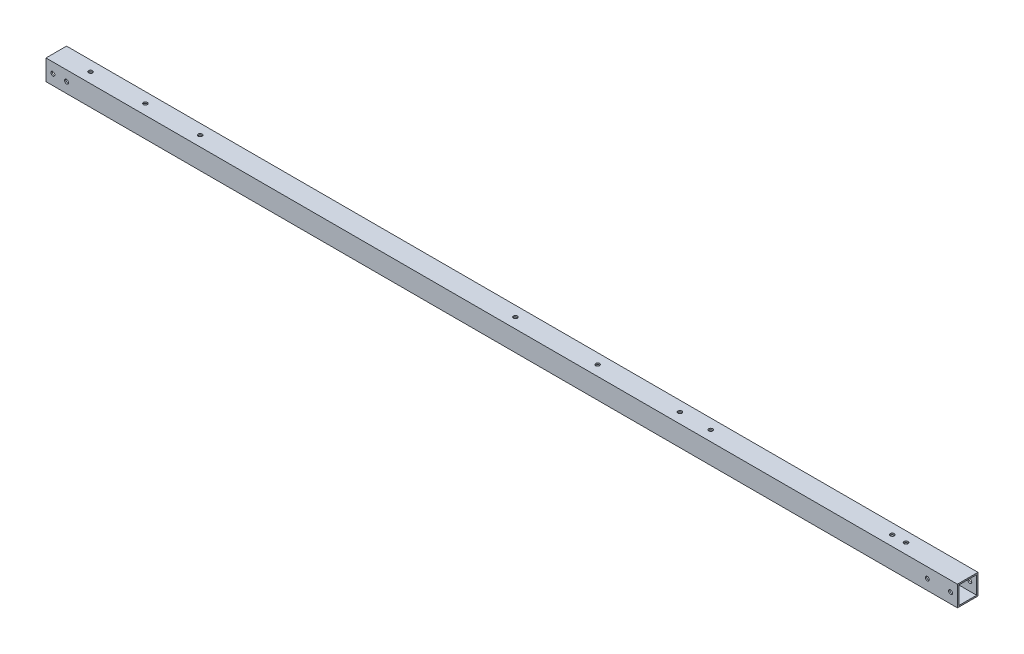
ISO-10303-21;
HEADER;
FILE_DESCRIPTION(('STEP AP214'),'2;1');
FILE_NAME('part.step','',(''),(''),'','','');
FILE_SCHEMA(('AUTOMOTIVE_DESIGN { 1 0 10303 214 1 1 1 1 }'));
ENDSEC;
DATA;
#1=APPLICATION_CONTEXT('core data for automotive mechanical design processes');
#2=APPLICATION_PROTOCOL_DEFINITION('international standard','automotive_design',2000,#1);
#3=PRODUCT_CONTEXT('',#1,'mechanical');
#4=PRODUCT('Part','Part','',(#3));
#5=PRODUCT_RELATED_PRODUCT_CATEGORY('part','',(#4));
#6=PRODUCT_DEFINITION_FORMATION('','',#4);
#7=PRODUCT_DEFINITION_CONTEXT('part definition',#1,'design');
#8=PRODUCT_DEFINITION('design','',#6,#7);
#9=PRODUCT_DEFINITION_SHAPE('','',#8);
#10=(LENGTH_UNIT() NAMED_UNIT(*) SI_UNIT(.MILLI.,.METRE.));
#11=(NAMED_UNIT(*) PLANE_ANGLE_UNIT() SI_UNIT($,.RADIAN.));
#12=(NAMED_UNIT(*) SI_UNIT($,.STERADIAN.) SOLID_ANGLE_UNIT());
#13=UNCERTAINTY_MEASURE_WITH_UNIT(LENGTH_MEASURE(1.E-05),#10,'distance_accuracy_value','');
#14=(GEOMETRIC_REPRESENTATION_CONTEXT(3) GLOBAL_UNCERTAINTY_ASSIGNED_CONTEXT((#13)) GLOBAL_UNIT_ASSIGNED_CONTEXT((#10,
#11,#12)) REPRESENTATION_CONTEXT('',''));
#15=CARTESIAN_POINT('',(0.,0.,0.));
#16=DIRECTION('',(0.,0.,1.));
#17=DIRECTION('',(1.,0.,0.));
#18=AXIS2_PLACEMENT_3D('',#15,#16,#17);
#19=CARTESIAN_POINT('',(665.,0.,0.));
#20=DIRECTION('',(-1.,0.,0.));
#21=DIRECTION('',(0.,0.,1.));
#22=AXIS2_PLACEMENT_3D('',#19,#20,#21);
#23=PLANE('',#22);
#24=DIRECTION('',(0.,1.,0.));
#25=VECTOR('',#24,1.);
#26=CARTESIAN_POINT('',(665.,-7.5,-7.5));
#27=LINE('',#26,#25);
#28=CARTESIAN_POINT('',(665.,-7.5,-7.5));
#29=VERTEX_POINT('',#28);
#30=CARTESIAN_POINT('',(665.,7.5,-7.5));
#31=VERTEX_POINT('',#30);
#32=EDGE_CURVE('E146',#29,#31,#27,.T.);
#33=ORIENTED_EDGE('',*,*,#32,.T.);
#34=DIRECTION('',(0.,0.,1.));
#35=VECTOR('',#34,1.);
#36=CARTESIAN_POINT('',(665.,7.5,7.5));
#37=LINE('',#36,#35);
#38=CARTESIAN_POINT('',(665.,7.5,7.5));
#39=VERTEX_POINT('',#38);
#40=EDGE_CURVE('E149',#31,#39,#37,.T.);
#41=ORIENTED_EDGE('',*,*,#40,.T.);
#42=DIRECTION('',(0.,-1.,0.));
#43=VECTOR('',#42,1.);
#44=CARTESIAN_POINT('',(665.,-7.5,7.5));
#45=LINE('',#44,#43);
#46=CARTESIAN_POINT('',(665.,-7.5,7.5));
#47=VERTEX_POINT('',#46);
#48=EDGE_CURVE('E152',#39,#47,#45,.T.);
#49=ORIENTED_EDGE('',*,*,#48,.T.);
#50=DIRECTION('',(0.,0.,-1.));
#51=VECTOR('',#50,1.);
#52=CARTESIAN_POINT('',(665.,-7.5,7.5));
#53=LINE('',#52,#51);
#54=EDGE_CURVE('E154',#47,#29,#53,.T.);
#55=ORIENTED_EDGE('',*,*,#54,.T.);
#56=EDGE_LOOP('',(#33,#41,#49,#55));
#57=FACE_BOUND('',#56,.T.);
#58=DIRECTION('',(0.,0.,-1.));
#59=VECTOR('',#58,1.);
#60=CARTESIAN_POINT('',(665.,-6.5,6.5));
#61=LINE('',#60,#59);
#62=CARTESIAN_POINT('',(665.,-6.5,6.5));
#63=VERTEX_POINT('',#62);
#64=CARTESIAN_POINT('',(665.,-6.5,-6.5));
#65=VERTEX_POINT('',#64);
#66=EDGE_CURVE('E108',#63,#65,#61,.T.);
#67=ORIENTED_EDGE('',*,*,#66,.F.);
#68=DIRECTION('',(0.,-1.,0.));
#69=VECTOR('',#68,1.);
#70=CARTESIAN_POINT('',(665.,-6.5,6.5));
#71=LINE('',#70,#69);
#72=CARTESIAN_POINT('',(665.,6.5,6.5));
#73=VERTEX_POINT('',#72);
#74=EDGE_CURVE('E130',#73,#63,#71,.T.);
#75=ORIENTED_EDGE('',*,*,#74,.F.);
#76=DIRECTION('',(0.,0.,1.));
#77=VECTOR('',#76,1.);
#78=CARTESIAN_POINT('',(665.,6.5,6.5));
#79=LINE('',#78,#77);
#80=CARTESIAN_POINT('',(665.,6.5,-6.5));
#81=VERTEX_POINT('',#80);
#82=EDGE_CURVE('E128',#81,#73,#79,.T.);
#83=ORIENTED_EDGE('',*,*,#82,.F.);
#84=DIRECTION('',(0.,1.,0.));
#85=VECTOR('',#84,1.);
#86=CARTESIAN_POINT('',(665.,-6.5,-6.5));
#87=LINE('',#86,#85);
#88=EDGE_CURVE('E116',#65,#81,#87,.T.);
#89=ORIENTED_EDGE('',*,*,#88,.F.);
#90=EDGE_LOOP('',(#67,#75,#83,#89));
#91=FACE_BOUND('',#90,.T.);
#92=ADVANCED_FACE('F41',(#57,#91),#23,.F.);
#93=CARTESIAN_POINT('',(0.,0.,0.));
#94=DIRECTION('',(-1.,0.,0.));
#95=DIRECTION('',(0.,0.,1.));
#96=AXIS2_PLACEMENT_3D('',#93,#94,#95);
#97=PLANE('',#96);
#98=DIRECTION('',(0.,1.,0.));
#99=VECTOR('',#98,1.);
#100=CARTESIAN_POINT('',(0.,-7.5,-7.5));
#101=LINE('',#100,#99);
#102=CARTESIAN_POINT('',(0.,-7.5,-7.5));
#103=VERTEX_POINT('',#102);
#104=CARTESIAN_POINT('',(0.,7.5,-7.5));
#105=VERTEX_POINT('',#104);
#106=EDGE_CURVE('E124',#103,#105,#101,.T.);
#107=ORIENTED_EDGE('',*,*,#106,.F.);
#108=DIRECTION('',(0.,0.,-1.));
#109=VECTOR('',#108,1.);
#110=CARTESIAN_POINT('',(0.,-7.5,7.5));
#111=LINE('',#110,#109);
#112=CARTESIAN_POINT('',(0.,-7.5,7.5));
#113=VERTEX_POINT('',#112);
#114=EDGE_CURVE('E150',#113,#103,#111,.T.);
#115=ORIENTED_EDGE('',*,*,#114,.F.);
#116=DIRECTION('',(0.,-1.,0.));
#117=VECTOR('',#116,1.);
#118=CARTESIAN_POINT('',(0.,-7.5,7.5));
#119=LINE('',#118,#117);
#120=CARTESIAN_POINT('',(0.,7.5,7.5));
#121=VERTEX_POINT('',#120);
#122=EDGE_CURVE('E161',#121,#113,#119,.T.);
#123=ORIENTED_EDGE('',*,*,#122,.F.);
#124=DIRECTION('',(0.,0.,1.));
#125=VECTOR('',#124,1.);
#126=CARTESIAN_POINT('',(0.,7.5,7.5));
#127=LINE('',#126,#125);
#128=EDGE_CURVE('E159',#105,#121,#127,.T.);
#129=ORIENTED_EDGE('',*,*,#128,.F.);
#130=EDGE_LOOP('',(#107,#115,#123,#129));
#131=FACE_BOUND('',#130,.T.);
#132=DIRECTION('',(0.,-1.,0.));
#133=VECTOR('',#132,1.);
#134=CARTESIAN_POINT('',(0.,-6.5,6.5));
#135=LINE('',#134,#133);
#136=CARTESIAN_POINT('',(0.,6.5,6.5));
#137=VERTEX_POINT('',#136);
#138=CARTESIAN_POINT('',(0.,-6.5,6.5));
#139=VERTEX_POINT('',#138);
#140=EDGE_CURVE('E117',#137,#139,#135,.T.);
#141=ORIENTED_EDGE('',*,*,#140,.T.);
#142=DIRECTION('',(0.,0.,-1.));
#143=VECTOR('',#142,1.);
#144=CARTESIAN_POINT('',(0.,-6.5,6.5));
#145=LINE('',#144,#143);
#146=CARTESIAN_POINT('',(0.,-6.5,-6.5));
#147=VERTEX_POINT('',#146);
#148=EDGE_CURVE('E66',#139,#147,#145,.T.);
#149=ORIENTED_EDGE('',*,*,#148,.T.);
#150=DIRECTION('',(0.,1.,0.));
#151=VECTOR('',#150,1.);
#152=CARTESIAN_POINT('',(0.,-6.5,-6.5));
#153=LINE('',#152,#151);
#154=CARTESIAN_POINT('',(0.,6.5,-6.5));
#155=VERTEX_POINT('',#154);
#156=EDGE_CURVE('E123',#147,#155,#153,.T.);
#157=ORIENTED_EDGE('',*,*,#156,.T.);
#158=DIRECTION('',(0.,0.,1.));
#159=VECTOR('',#158,1.);
#160=CARTESIAN_POINT('',(0.,6.5,6.5));
#161=LINE('',#160,#159);
#162=EDGE_CURVE('E138',#155,#137,#161,.T.);
#163=ORIENTED_EDGE('',*,*,#162,.T.);
#164=EDGE_LOOP('',(#141,#149,#157,#163));
#165=FACE_BOUND('',#164,.T.);
#166=ADVANCED_FACE('F350',(#131,#165),#97,.T.);
#167=CARTESIAN_POINT('',(665.,-7.5,-7.5));
#168=DIRECTION('',(0.,0.,1.));
#169=DIRECTION('',(1.,0.,0.));
#170=AXIS2_PLACEMENT_3D('',#167,#168,#169);
#171=PLANE('',#170);
#172=CARTESIAN_POINT('',(4.99999999825829,-1.26358125351889E-10,-7.5));
#173=DIRECTION('',(0.,0.,1.));
#174=DIRECTION('',(1.,0.,0.));
#175=AXIS2_PLACEMENT_3D('',#172,#173,#174);
#176=CIRCLE('',#175,1.44999999999994);
#177=CARTESIAN_POINT('',(6.44999999825823,-1.26358125351889E-10,-7.5));
#178=VERTEX_POINT('',#177);
#179=EDGE_CURVE('E468',#178,#178,#176,.T.);
#180=ORIENTED_EDGE('',*,*,#179,.T.);
#181=EDGE_LOOP('',(#180));
#182=FACE_BOUND('',#181,.T.);
#183=CARTESIAN_POINT('',(660.000000000002,-1.49877506239182E-10,-7.5));
#184=DIRECTION('',(0.,0.,1.));
#185=DIRECTION('',(1.,0.,0.));
#186=AXIS2_PLACEMENT_3D('',#183,#184,#185);
#187=CIRCLE('',#186,1.45000000000005);
#188=CARTESIAN_POINT('',(661.450000000002,-1.49877506239182E-10,-7.5));
#189=VERTEX_POINT('',#188);
#190=EDGE_CURVE('E461',#189,#189,#187,.T.);
#191=ORIENTED_EDGE('',*,*,#190,.T.);
#192=EDGE_LOOP('',(#191));
#193=FACE_BOUND('',#192,.T.);
#194=CARTESIAN_POINT('',(643.000000000002,-1.46057645145081E-10,-7.5));
#195=DIRECTION('',(0.,0.,1.));
#196=DIRECTION('',(1.,0.,0.));
#197=AXIS2_PLACEMENT_3D('',#194,#195,#196);
#198=CIRCLE('',#197,1.44999999999995);
#199=CARTESIAN_POINT('',(644.450000000002,-1.46057645145081E-10,-7.5));
#200=VERTEX_POINT('',#199);
#201=EDGE_CURVE('E456',#200,#200,#198,.T.);
#202=ORIENTED_EDGE('',*,*,#201,.T.);
#203=EDGE_LOOP('',(#202));
#204=FACE_BOUND('',#203,.T.);
#205=CARTESIAN_POINT('',(14.9999999982583,-1.26345982287557E-10,-7.5));
#206=DIRECTION('',(0.,0.,1.));
#207=DIRECTION('',(1.,0.,0.));
#208=AXIS2_PLACEMENT_3D('',#205,#206,#207);
#209=CIRCLE('',#208,1.44999999999994);
#210=CARTESIAN_POINT('',(16.4499999982582,-1.26345982287557E-10,-7.5));
#211=VERTEX_POINT('',#210);
#212=EDGE_CURVE('E211',#211,#211,#209,.T.);
#213=ORIENTED_EDGE('',*,*,#212,.T.);
#214=EDGE_LOOP('',(#213));
#215=FACE_BOUND('',#214,.T.);
#216=ORIENTED_EDGE('',*,*,#106,.T.);
#217=DIRECTION('',(-1.,0.,0.));
#218=VECTOR('',#217,1.);
#219=CARTESIAN_POINT('',(665.,7.5,-7.5));
#220=LINE('',#219,#218);
#221=EDGE_CURVE('E11',#31,#105,#220,.T.);
#222=ORIENTED_EDGE('',*,*,#221,.F.);
#223=ORIENTED_EDGE('',*,*,#32,.F.);
#224=DIRECTION('',(-1.,0.,0.));
#225=VECTOR('',#224,1.);
#226=CARTESIAN_POINT('',(665.,-7.5,-7.5));
#227=LINE('',#226,#225);
#228=EDGE_CURVE('E156',#29,#103,#227,.T.);
#229=ORIENTED_EDGE('',*,*,#228,.T.);
#230=EDGE_LOOP('',(#216,#222,#223,#229));
#231=FACE_BOUND('',#230,.T.);
#232=ADVANCED_FACE('F43',(#182,#193,#204,#215,#231),#171,.F.);
#233=CARTESIAN_POINT('',(665.,7.5,7.5));
#234=DIRECTION('',(0.,-1.,0.));
#235=DIRECTION('',(0.,0.,-1.));
#236=AXIS2_PLACEMENT_3D('',#233,#234,#235);
#237=PLANE('',#236);
#238=CARTESIAN_POINT('',(477.5,7.5,0.));
#239=DIRECTION('',(0.,1.,0.));
#240=DIRECTION('',(0.,0.,1.));
#241=AXIS2_PLACEMENT_3D('',#238,#239,#240);
#242=CIRCLE('',#241,1.45);
#243=CARTESIAN_POINT('',(477.5,7.5,1.45000000000006));
#244=VERTEX_POINT('',#243);
#245=EDGE_CURVE('E257',#244,#244,#242,.T.);
#246=ORIENTED_EDGE('',*,*,#245,.F.);
#247=EDGE_LOOP('',(#246));
#248=FACE_BOUND('',#247,.T.);
#249=CARTESIAN_POINT('',(455.,7.5,0.));
#250=DIRECTION('',(0.,1.,0.));
#251=DIRECTION('',(0.,0.,1.));
#252=AXIS2_PLACEMENT_3D('',#249,#250,#251);
#253=CIRCLE('',#252,1.45);
#254=CARTESIAN_POINT('',(455.,7.5,1.45000000000006));
#255=VERTEX_POINT('',#254);
#256=EDGE_CURVE('E264',#255,#255,#253,.T.);
#257=ORIENTED_EDGE('',*,*,#256,.F.);
#258=EDGE_LOOP('',(#257));
#259=FACE_BOUND('',#258,.T.);
#260=CARTESIAN_POINT('',(395.,7.5,0.));
#261=DIRECTION('',(0.,1.,0.));
#262=DIRECTION('',(0.,0.,1.));
#263=AXIS2_PLACEMENT_3D('',#260,#261,#262);
#264=CIRCLE('',#263,1.45);
#265=CARTESIAN_POINT('',(395.,7.5,1.45000000000007));
#266=VERTEX_POINT('',#265);
#267=EDGE_CURVE('E270',#266,#266,#264,.T.);
#268=ORIENTED_EDGE('',*,*,#267,.F.);
#269=EDGE_LOOP('',(#268));
#270=FACE_BOUND('',#269,.T.);
#271=CARTESIAN_POINT('',(335.,7.5,0.));
#272=DIRECTION('',(0.,1.,0.));
#273=DIRECTION('',(0.,0.,1.));
#274=AXIS2_PLACEMENT_3D('',#271,#272,#273);
#275=CIRCLE('',#274,1.45);
#276=CARTESIAN_POINT('',(335.,7.5,1.45000000000008));
#277=VERTEX_POINT('',#276);
#278=EDGE_CURVE('E276',#277,#277,#275,.T.);
#279=ORIENTED_EDGE('',*,*,#278,.F.);
#280=EDGE_LOOP('',(#279));
#281=FACE_BOUND('',#280,.T.);
#282=CARTESIAN_POINT('',(620.,7.5,-8.56953397132543E-13));
#283=DIRECTION('',(0.,1.,0.));
#284=DIRECTION('',(0.,0.,1.));
#285=AXIS2_PLACEMENT_3D('',#282,#283,#284);
#286=CIRCLE('',#285,1.44999999999994);
#287=CARTESIAN_POINT('',(620.,7.5,1.44999999999909));
#288=VERTEX_POINT('',#287);
#289=EDGE_CURVE('E240',#288,#288,#286,.T.);
#290=ORIENTED_EDGE('',*,*,#289,.F.);
#291=EDGE_LOOP('',(#290));
#292=FACE_BOUND('',#291,.T.);
#293=CARTESIAN_POINT('',(25.0000000000008,7.5,-3.46944695195361E-13));
#294=DIRECTION('',(0.,1.,0.));
#295=DIRECTION('',(0.,0.,1.));
#296=AXIS2_PLACEMENT_3D('',#293,#294,#295);
#297=CIRCLE('',#296,1.45);
#298=CARTESIAN_POINT('',(25.0000000000008,7.5,1.44999999999965));
#299=VERTEX_POINT('',#298);
#300=EDGE_CURVE('E233',#299,#299,#297,.T.);
#301=ORIENTED_EDGE('',*,*,#300,.F.);
#302=EDGE_LOOP('',(#301));
#303=FACE_BOUND('',#302,.T.);
#304=CARTESIAN_POINT('',(65.0000000000008,7.5,-3.53883589099269E-13));
#305=DIRECTION('',(0.,1.,0.));
#306=DIRECTION('',(0.,0.,1.));
#307=AXIS2_PLACEMENT_3D('',#304,#305,#306);
#308=CIRCLE('',#307,1.45);
#309=CARTESIAN_POINT('',(65.0000000000008,7.5,1.44999999999965));
#310=VERTEX_POINT('',#309);
#311=EDGE_CURVE('E252',#310,#310,#308,.T.);
#312=ORIENTED_EDGE('',*,*,#311,.F.);
#313=EDGE_LOOP('',(#312));
#314=FACE_BOUND('',#313,.T.);
#315=CARTESIAN_POINT('',(105.000000000001,7.5,-3.60822483003176E-13));
#316=DIRECTION('',(0.,1.,0.));
#317=DIRECTION('',(0.,0.,1.));
#318=AXIS2_PLACEMENT_3D('',#315,#316,#317);
#319=CIRCLE('',#318,1.45);
#320=CARTESIAN_POINT('',(105.000000000001,7.5,1.44999999999964));
#321=VERTEX_POINT('',#320);
#322=EDGE_CURVE('E245',#321,#321,#319,.T.);
#323=ORIENTED_EDGE('',*,*,#322,.F.);
#324=EDGE_LOOP('',(#323));
#325=FACE_BOUND('',#324,.T.);
#326=CARTESIAN_POINT('',(610.,7.5,-8.56953397132543E-13));
#327=DIRECTION('',(0.,1.,0.));
#328=DIRECTION('',(0.,0.,1.));
#329=AXIS2_PLACEMENT_3D('',#326,#327,#328);
#330=CIRCLE('',#329,1.44999999999994);
#331=CARTESIAN_POINT('',(610.,7.5,1.44999999999909));
#332=VERTEX_POINT('',#331);
#333=EDGE_CURVE('E260',#332,#332,#330,.T.);
#334=ORIENTED_EDGE('',*,*,#333,.F.);
#335=EDGE_LOOP('',(#334));
#336=FACE_BOUND('',#335,.T.);
#337=ORIENTED_EDGE('',*,*,#128,.T.);
#338=DIRECTION('',(-1.,0.,0.));
#339=VECTOR('',#338,1.);
#340=CARTESIAN_POINT('',(665.,7.5,7.5));
#341=LINE('',#340,#339);
#342=EDGE_CURVE('E50',#39,#121,#341,.T.);
#343=ORIENTED_EDGE('',*,*,#342,.F.);
#344=ORIENTED_EDGE('',*,*,#40,.F.);
#345=ORIENTED_EDGE('',*,*,#221,.T.);
#346=EDGE_LOOP('',(#337,#343,#344,#345));
#347=FACE_BOUND('',#346,.T.);
#348=ADVANCED_FACE('F354',(#248,#259,#270,#281,#292,#303,#314,#325,#336,#347),#237,.F.);
#349=CARTESIAN_POINT('',(665.,-7.5,7.5));
#350=DIRECTION('',(0.,0.,-1.));
#351=DIRECTION('',(-1.,0.,0.));
#352=AXIS2_PLACEMENT_3D('',#349,#350,#351);
#353=PLANE('',#352);
#354=CARTESIAN_POINT('',(4.99999999825829,-1.26358125351889E-10,7.5));
#355=DIRECTION('',(0.,0.,1.));
#356=DIRECTION('',(1.,0.,0.));
#357=AXIS2_PLACEMENT_3D('',#354,#355,#356);
#358=CIRCLE('',#357,1.44999999999994);
#359=CARTESIAN_POINT('',(6.44999999825823,-1.26358125351889E-10,7.5));
#360=VERTEX_POINT('',#359);
#361=EDGE_CURVE('E464',#360,#360,#358,.T.);
#362=ORIENTED_EDGE('',*,*,#361,.F.);
#363=EDGE_LOOP('',(#362));
#364=FACE_BOUND('',#363,.T.);
#365=CARTESIAN_POINT('',(660.000000000002,-1.49877506239182E-10,7.5));
#366=DIRECTION('',(0.,0.,1.));
#367=DIRECTION('',(1.,0.,0.));
#368=AXIS2_PLACEMENT_3D('',#365,#366,#367);
#369=CIRCLE('',#368,1.45000000000005);
#370=CARTESIAN_POINT('',(661.450000000002,-1.49877506239182E-10,7.5));
#371=VERTEX_POINT('',#370);
#372=EDGE_CURVE('E471',#371,#371,#369,.T.);
#373=ORIENTED_EDGE('',*,*,#372,.F.);
#374=EDGE_LOOP('',(#373));
#375=FACE_BOUND('',#374,.T.);
#376=CARTESIAN_POINT('',(643.000000000002,-1.46057645145081E-10,7.5));
#377=DIRECTION('',(0.,0.,1.));
#378=DIRECTION('',(1.,0.,0.));
#379=AXIS2_PLACEMENT_3D('',#376,#377,#378);
#380=CIRCLE('',#379,1.44999999999995);
#381=CARTESIAN_POINT('',(644.450000000002,-1.46057645145081E-10,7.5));
#382=VERTEX_POINT('',#381);
#383=EDGE_CURVE('E458',#382,#382,#380,.T.);
#384=ORIENTED_EDGE('',*,*,#383,.F.);
#385=EDGE_LOOP('',(#384));
#386=FACE_BOUND('',#385,.T.);
#387=CARTESIAN_POINT('',(14.9999999982583,-1.26345982287557E-10,7.5));
#388=DIRECTION('',(0.,0.,1.));
#389=DIRECTION('',(1.,0.,0.));
#390=AXIS2_PLACEMENT_3D('',#387,#388,#389);
#391=CIRCLE('',#390,1.44999999999994);
#392=CARTESIAN_POINT('',(16.4499999982582,-1.26345982287557E-10,7.5));
#393=VERTEX_POINT('',#392);
#394=EDGE_CURVE('E467',#393,#393,#391,.T.);
#395=ORIENTED_EDGE('',*,*,#394,.F.);
#396=EDGE_LOOP('',(#395));
#397=FACE_BOUND('',#396,.T.);
#398=ORIENTED_EDGE('',*,*,#122,.T.);
#399=DIRECTION('',(-1.,0.,0.));
#400=VECTOR('',#399,1.);
#401=CARTESIAN_POINT('',(665.,-7.5,7.5));
#402=LINE('',#401,#400);
#403=EDGE_CURVE('E166',#47,#113,#402,.T.);
#404=ORIENTED_EDGE('',*,*,#403,.F.);
#405=ORIENTED_EDGE('',*,*,#48,.F.);
#406=ORIENTED_EDGE('',*,*,#342,.T.);
#407=EDGE_LOOP('',(#398,#404,#405,#406));
#408=FACE_BOUND('',#407,.T.);
#409=ADVANCED_FACE('F337',(#364,#375,#386,#397,#408),#353,.F.);
#410=CARTESIAN_POINT('',(665.,-7.5,7.5));
#411=DIRECTION('',(0.,1.,0.));
#412=DIRECTION('',(0.,0.,1.));
#413=AXIS2_PLACEMENT_3D('',#410,#411,#412);
#414=PLANE('',#413);
#415=CARTESIAN_POINT('',(477.5,-7.5,0.));
#416=DIRECTION('',(0.,1.,0.));
#417=DIRECTION('',(0.,0.,1.));
#418=AXIS2_PLACEMENT_3D('',#415,#416,#417);
#419=CIRCLE('',#418,1.45);
#420=CARTESIAN_POINT('',(477.5,-7.5,1.45000000000006));
#421=VERTEX_POINT('',#420);
#422=EDGE_CURVE('E261',#421,#421,#419,.T.);
#423=ORIENTED_EDGE('',*,*,#422,.T.);
#424=EDGE_LOOP('',(#423));
#425=FACE_BOUND('',#424,.T.);
#426=CARTESIAN_POINT('',(455.,-7.5,0.));
#427=DIRECTION('',(0.,1.,0.));
#428=DIRECTION('',(0.,0.,1.));
#429=AXIS2_PLACEMENT_3D('',#426,#427,#428);
#430=CIRCLE('',#429,1.45);
#431=CARTESIAN_POINT('',(455.,-7.5,1.45000000000006));
#432=VERTEX_POINT('',#431);
#433=EDGE_CURVE('E267',#432,#432,#430,.T.);
#434=ORIENTED_EDGE('',*,*,#433,.T.);
#435=EDGE_LOOP('',(#434));
#436=FACE_BOUND('',#435,.T.);
#437=CARTESIAN_POINT('',(395.,-7.5,0.));
#438=DIRECTION('',(0.,1.,0.));
#439=DIRECTION('',(0.,0.,1.));
#440=AXIS2_PLACEMENT_3D('',#437,#438,#439);
#441=CIRCLE('',#440,1.45);
#442=CARTESIAN_POINT('',(395.,-7.5,1.45000000000007));
#443=VERTEX_POINT('',#442);
#444=EDGE_CURVE('E273',#443,#443,#441,.T.);
#445=ORIENTED_EDGE('',*,*,#444,.T.);
#446=EDGE_LOOP('',(#445));
#447=FACE_BOUND('',#446,.T.);
#448=CARTESIAN_POINT('',(335.,-7.5,0.));
#449=DIRECTION('',(0.,1.,0.));
#450=DIRECTION('',(0.,0.,1.));
#451=AXIS2_PLACEMENT_3D('',#448,#449,#450);
#452=CIRCLE('',#451,1.45);
#453=CARTESIAN_POINT('',(335.,-7.5,1.45000000000008));
#454=VERTEX_POINT('',#453);
#455=EDGE_CURVE('E248',#454,#454,#452,.T.);
#456=ORIENTED_EDGE('',*,*,#455,.T.);
#457=EDGE_LOOP('',(#456));
#458=FACE_BOUND('',#457,.T.);
#459=CARTESIAN_POINT('',(620.,-7.5,-8.56953397132543E-13));
#460=DIRECTION('',(0.,1.,0.));
#461=DIRECTION('',(0.,0.,1.));
#462=AXIS2_PLACEMENT_3D('',#459,#460,#461);
#463=CIRCLE('',#462,1.44999999999994);
#464=CARTESIAN_POINT('',(620.,-7.5,1.44999999999909));
#465=VERTEX_POINT('',#464);
#466=EDGE_CURVE('E232',#465,#465,#463,.T.);
#467=ORIENTED_EDGE('',*,*,#466,.T.);
#468=EDGE_LOOP('',(#467));
#469=FACE_BOUND('',#468,.T.);
#470=CARTESIAN_POINT('',(25.0000000000008,-7.5,-3.46944695195361E-13));
#471=DIRECTION('',(0.,1.,0.));
#472=DIRECTION('',(0.,0.,1.));
#473=AXIS2_PLACEMENT_3D('',#470,#471,#472);
#474=CIRCLE('',#473,1.45);
#475=CARTESIAN_POINT('',(25.0000000000008,-7.5,1.44999999999965));
#476=VERTEX_POINT('',#475);
#477=EDGE_CURVE('E237',#476,#476,#474,.T.);
#478=ORIENTED_EDGE('',*,*,#477,.T.);
#479=EDGE_LOOP('',(#478));
#480=FACE_BOUND('',#479,.T.);
#481=CARTESIAN_POINT('',(65.0000000000008,-7.5,-3.53883589099269E-13));
#482=DIRECTION('',(0.,1.,0.));
#483=DIRECTION('',(0.,0.,1.));
#484=AXIS2_PLACEMENT_3D('',#481,#482,#483);
#485=CIRCLE('',#484,1.45);
#486=CARTESIAN_POINT('',(65.0000000000008,-7.5,1.44999999999965));
#487=VERTEX_POINT('',#486);
#488=EDGE_CURVE('E236',#487,#487,#485,.T.);
#489=ORIENTED_EDGE('',*,*,#488,.T.);
#490=EDGE_LOOP('',(#489));
#491=FACE_BOUND('',#490,.T.);
#492=CARTESIAN_POINT('',(105.000000000001,-7.5,-3.60822483003176E-13));
#493=DIRECTION('',(0.,1.,0.));
#494=DIRECTION('',(0.,0.,1.));
#495=AXIS2_PLACEMENT_3D('',#492,#493,#494);
#496=CIRCLE('',#495,1.45);
#497=CARTESIAN_POINT('',(105.000000000001,-7.5,1.44999999999964));
#498=VERTEX_POINT('',#497);
#499=EDGE_CURVE('E249',#498,#498,#496,.T.);
#500=ORIENTED_EDGE('',*,*,#499,.T.);
#501=EDGE_LOOP('',(#500));
#502=FACE_BOUND('',#501,.T.);
#503=CARTESIAN_POINT('',(610.,-7.5,-8.56953397132543E-13));
#504=DIRECTION('',(0.,1.,0.));
#505=DIRECTION('',(0.,0.,1.));
#506=AXIS2_PLACEMENT_3D('',#503,#504,#505);
#507=CIRCLE('',#506,1.44999999999994);
#508=CARTESIAN_POINT('',(610.,-7.5,1.44999999999909));
#509=VERTEX_POINT('',#508);
#510=EDGE_CURVE('E175',#509,#509,#507,.T.);
#511=ORIENTED_EDGE('',*,*,#510,.T.);
#512=EDGE_LOOP('',(#511));
#513=FACE_BOUND('',#512,.T.);
#514=ORIENTED_EDGE('',*,*,#114,.T.);
#515=ORIENTED_EDGE('',*,*,#228,.F.);
#516=ORIENTED_EDGE('',*,*,#54,.F.);
#517=ORIENTED_EDGE('',*,*,#403,.T.);
#518=EDGE_LOOP('',(#514,#515,#516,#517));
#519=FACE_BOUND('',#518,.T.);
#520=ADVANCED_FACE('F308',(#425,#436,#447,#458,#469,#480,#491,#502,#513,#519),#414,.F.);
#521=CARTESIAN_POINT('',(665.,-6.5,6.5));
#522=DIRECTION('',(0.,1.,0.));
#523=DIRECTION('',(0.,0.,1.));
#524=AXIS2_PLACEMENT_3D('',#521,#522,#523);
#525=PLANE('',#524);
#526=CARTESIAN_POINT('',(477.5,-6.5,0.));
#527=DIRECTION('',(0.,1.,0.));
#528=DIRECTION('',(0.,0.,1.));
#529=AXIS2_PLACEMENT_3D('',#526,#527,#528);
#530=CIRCLE('',#529,1.45);
#531=CARTESIAN_POINT('',(477.5,-6.5,1.45000000000006));
#532=VERTEX_POINT('',#531);
#533=EDGE_CURVE('E136',#532,#532,#530,.T.);
#534=ORIENTED_EDGE('',*,*,#533,.F.);
#535=EDGE_LOOP('',(#534));
#536=FACE_BOUND('',#535,.T.);
#537=CARTESIAN_POINT('',(455.,-6.5,0.));
#538=DIRECTION('',(0.,1.,0.));
#539=DIRECTION('',(0.,0.,1.));
#540=AXIS2_PLACEMENT_3D('',#537,#538,#539);
#541=CIRCLE('',#540,1.45);
#542=CARTESIAN_POINT('',(455.,-6.5,1.45000000000006));
#543=VERTEX_POINT('',#542);
#544=EDGE_CURVE('E203',#543,#543,#541,.T.);
#545=ORIENTED_EDGE('',*,*,#544,.F.);
#546=EDGE_LOOP('',(#545));
#547=FACE_BOUND('',#546,.T.);
#548=CARTESIAN_POINT('',(395.,-6.5,0.));
#549=DIRECTION('',(0.,1.,0.));
#550=DIRECTION('',(0.,0.,1.));
#551=AXIS2_PLACEMENT_3D('',#548,#549,#550);
#552=CIRCLE('',#551,1.45);
#553=CARTESIAN_POINT('',(395.,-6.5,1.45000000000007));
#554=VERTEX_POINT('',#553);
#555=EDGE_CURVE('E199',#554,#554,#552,.T.);
#556=ORIENTED_EDGE('',*,*,#555,.F.);
#557=EDGE_LOOP('',(#556));
#558=FACE_BOUND('',#557,.T.);
#559=CARTESIAN_POINT('',(335.,-6.5,0.));
#560=DIRECTION('',(0.,1.,0.));
#561=DIRECTION('',(0.,0.,1.));
#562=AXIS2_PLACEMENT_3D('',#559,#560,#561);
#563=CIRCLE('',#562,1.45);
#564=CARTESIAN_POINT('',(335.,-6.5,1.45000000000008));
#565=VERTEX_POINT('',#564);
#566=EDGE_CURVE('E195',#565,#565,#563,.T.);
#567=ORIENTED_EDGE('',*,*,#566,.F.);
#568=EDGE_LOOP('',(#567));
#569=FACE_BOUND('',#568,.T.);
#570=CARTESIAN_POINT('',(620.,-6.5,-8.56953397132543E-13));
#571=DIRECTION('',(0.,1.,0.));
#572=DIRECTION('',(0.,0.,1.));
#573=AXIS2_PLACEMENT_3D('',#570,#571,#572);
#574=CIRCLE('',#573,1.44999999999994);
#575=CARTESIAN_POINT('',(620.,-6.5,1.44999999999909));
#576=VERTEX_POINT('',#575);
#577=EDGE_CURVE('E191',#576,#576,#574,.T.);
#578=ORIENTED_EDGE('',*,*,#577,.F.);
#579=EDGE_LOOP('',(#578));
#580=FACE_BOUND('',#579,.T.);
#581=CARTESIAN_POINT('',(25.0000000000008,-6.5,-3.46944695195361E-13));
#582=DIRECTION('',(0.,1.,0.));
#583=DIRECTION('',(0.,0.,1.));
#584=AXIS2_PLACEMENT_3D('',#581,#582,#583);
#585=CIRCLE('',#584,1.45);
#586=CARTESIAN_POINT('',(25.0000000000008,-6.5,1.44999999999965));
#587=VERTEX_POINT('',#586);
#588=EDGE_CURVE('E187',#587,#587,#585,.T.);
#589=ORIENTED_EDGE('',*,*,#588,.F.);
#590=EDGE_LOOP('',(#589));
#591=FACE_BOUND('',#590,.T.);
#592=CARTESIAN_POINT('',(65.0000000000008,-6.5,-3.53883589099269E-13));
#593=DIRECTION('',(0.,1.,0.));
#594=DIRECTION('',(0.,0.,1.));
#595=AXIS2_PLACEMENT_3D('',#592,#593,#594);
#596=CIRCLE('',#595,1.45);
#597=CARTESIAN_POINT('',(65.0000000000008,-6.5,1.44999999999965));
#598=VERTEX_POINT('',#597);
#599=EDGE_CURVE('E183',#598,#598,#596,.T.);
#600=ORIENTED_EDGE('',*,*,#599,.F.);
#601=EDGE_LOOP('',(#600));
#602=FACE_BOUND('',#601,.T.);
#603=CARTESIAN_POINT('',(105.000000000001,-6.5,-3.60822483003176E-13));
#604=DIRECTION('',(0.,1.,0.));
#605=DIRECTION('',(0.,0.,1.));
#606=AXIS2_PLACEMENT_3D('',#603,#604,#605);
#607=CIRCLE('',#606,1.45);
#608=CARTESIAN_POINT('',(105.000000000001,-6.5,1.44999999999964));
#609=VERTEX_POINT('',#608);
#610=EDGE_CURVE('E179',#609,#609,#607,.T.);
#611=ORIENTED_EDGE('',*,*,#610,.F.);
#612=EDGE_LOOP('',(#611));
#613=FACE_BOUND('',#612,.T.);
#614=CARTESIAN_POINT('',(610.,-6.5,-8.56953397132543E-13));
#615=DIRECTION('',(0.,1.,0.));
#616=DIRECTION('',(0.,0.,1.));
#617=AXIS2_PLACEMENT_3D('',#614,#615,#616);
#618=CIRCLE('',#617,1.44999999999994);
#619=CARTESIAN_POINT('',(610.,-6.5,1.44999999999909));
#620=VERTEX_POINT('',#619);
#621=EDGE_CURVE('E174',#620,#620,#618,.T.);
#622=ORIENTED_EDGE('',*,*,#621,.F.);
#623=EDGE_LOOP('',(#622));
#624=FACE_BOUND('',#623,.T.);
#625=ORIENTED_EDGE('',*,*,#148,.F.);
#626=DIRECTION('',(-1.,0.,0.));
#627=VECTOR('',#626,1.);
#628=CARTESIAN_POINT('',(665.,-6.5,6.5));
#629=LINE('',#628,#627);
#630=EDGE_CURVE('E112',#63,#139,#629,.T.);
#631=ORIENTED_EDGE('',*,*,#630,.F.);
#632=ORIENTED_EDGE('',*,*,#66,.T.);
#633=DIRECTION('',(-1.,0.,0.));
#634=VECTOR('',#633,1.);
#635=CARTESIAN_POINT('',(665.,-6.5,-6.5));
#636=LINE('',#635,#634);
#637=EDGE_CURVE('E111',#65,#147,#636,.T.);
#638=ORIENTED_EDGE('',*,*,#637,.T.);
#639=EDGE_LOOP('',(#625,#631,#632,#638));
#640=FACE_BOUND('',#639,.T.);
#641=ADVANCED_FACE('F110',(#536,#547,#558,#569,#580,#591,#602,#613,#624,#640),#525,.T.);
#642=CARTESIAN_POINT('',(665.,-6.5,-6.5));
#643=DIRECTION('',(0.,0.,1.));
#644=DIRECTION('',(0.,-1.,0.));
#645=AXIS2_PLACEMENT_3D('',#642,#643,#644);
#646=PLANE('',#645);
#647=CARTESIAN_POINT('',(4.99999999825829,-1.26358125351889E-10,-6.5));
#648=DIRECTION('',(0.,0.,1.));
#649=DIRECTION('',(0.,-1.,0.));
#650=AXIS2_PLACEMENT_3D('',#647,#648,#649);
#651=CIRCLE('',#650,1.44999999999994);
#652=CARTESIAN_POINT('',(4.99999999825829,-1.4500000001263,-6.5));
#653=VERTEX_POINT('',#652);
#654=EDGE_CURVE('E229',#653,#653,#651,.T.);
#655=ORIENTED_EDGE('',*,*,#654,.F.);
#656=EDGE_LOOP('',(#655));
#657=FACE_BOUND('',#656,.T.);
#658=CARTESIAN_POINT('',(660.000000000002,-1.49877506239182E-10,-6.5));
#659=DIRECTION('',(0.,0.,1.));
#660=DIRECTION('',(0.,-1.,0.));
#661=AXIS2_PLACEMENT_3D('',#658,#659,#660);
#662=CIRCLE('',#661,1.45000000000005);
#663=CARTESIAN_POINT('',(660.000000000002,-1.45000000014993,-6.5));
#664=VERTEX_POINT('',#663);
#665=EDGE_CURVE('E217',#664,#664,#662,.T.);
#666=ORIENTED_EDGE('',*,*,#665,.F.);
#667=EDGE_LOOP('',(#666));
#668=FACE_BOUND('',#667,.T.);
#669=CARTESIAN_POINT('',(643.000000000002,-1.46057645145081E-10,-6.5));
#670=DIRECTION('',(0.,0.,1.));
#671=DIRECTION('',(0.,-1.,0.));
#672=AXIS2_PLACEMENT_3D('',#669,#670,#671);
#673=CIRCLE('',#672,1.44999999999995);
#674=CARTESIAN_POINT('',(643.000000000002,-1.450000000146,-6.5));
#675=VERTEX_POINT('',#674);
#676=EDGE_CURVE('E214',#675,#675,#673,.T.);
#677=ORIENTED_EDGE('',*,*,#676,.F.);
#678=EDGE_LOOP('',(#677));
#679=FACE_BOUND('',#678,.T.);
#680=CARTESIAN_POINT('',(14.9999999982583,-1.26345982287557E-10,-6.5));
#681=DIRECTION('',(0.,0.,1.));
#682=DIRECTION('',(0.,-1.,0.));
#683=AXIS2_PLACEMENT_3D('',#680,#681,#682);
#684=CIRCLE('',#683,1.44999999999994);
#685=CARTESIAN_POINT('',(14.9999999982583,-1.45000000012629,-6.5));
#686=VERTEX_POINT('',#685);
#687=EDGE_CURVE('E210',#686,#686,#684,.T.);
#688=ORIENTED_EDGE('',*,*,#687,.F.);
#689=EDGE_LOOP('',(#688));
#690=FACE_BOUND('',#689,.T.);
#691=ORIENTED_EDGE('',*,*,#156,.F.);
#692=ORIENTED_EDGE('',*,*,#637,.F.);
#693=ORIENTED_EDGE('',*,*,#88,.T.);
#694=DIRECTION('',(-1.,0.,0.));
#695=VECTOR('',#694,1.);
#696=CARTESIAN_POINT('',(665.,6.5,-6.5));
#697=LINE('',#696,#695);
#698=EDGE_CURVE('E125',#81,#155,#697,.T.);
#699=ORIENTED_EDGE('',*,*,#698,.T.);
#700=EDGE_LOOP('',(#691,#692,#693,#699));
#701=FACE_BOUND('',#700,.T.);
#702=ADVANCED_FACE('F120',(#657,#668,#679,#690,#701),#646,.T.);
#703=CARTESIAN_POINT('',(665.,6.5,6.5));
#704=DIRECTION('',(0.,-1.,0.));
#705=DIRECTION('',(0.,0.,-1.));
#706=AXIS2_PLACEMENT_3D('',#703,#704,#705);
#707=PLANE('',#706);
#708=CARTESIAN_POINT('',(477.5,6.5,0.));
#709=DIRECTION('',(0.,-1.,0.));
#710=DIRECTION('',(0.,0.,-1.));
#711=AXIS2_PLACEMENT_3D('',#708,#709,#710);
#712=CIRCLE('',#711,1.45);
#713=CARTESIAN_POINT('',(477.5,6.5,-1.44999999999995));
#714=VERTEX_POINT('',#713);
#715=EDGE_CURVE('E204',#714,#714,#712,.T.);
#716=ORIENTED_EDGE('',*,*,#715,.F.);
#717=EDGE_LOOP('',(#716));
#718=FACE_BOUND('',#717,.T.);
#719=CARTESIAN_POINT('',(455.,6.5,0.));
#720=DIRECTION('',(0.,-1.,0.));
#721=DIRECTION('',(0.,0.,-1.));
#722=AXIS2_PLACEMENT_3D('',#719,#720,#721);
#723=CIRCLE('',#722,1.45);
#724=CARTESIAN_POINT('',(455.,6.5,-1.44999999999994));
#725=VERTEX_POINT('',#724);
#726=EDGE_CURVE('E200',#725,#725,#723,.T.);
#727=ORIENTED_EDGE('',*,*,#726,.F.);
#728=EDGE_LOOP('',(#727));
#729=FACE_BOUND('',#728,.T.);
#730=CARTESIAN_POINT('',(395.,6.5,0.));
#731=DIRECTION('',(0.,-1.,0.));
#732=DIRECTION('',(0.,0.,-1.));
#733=AXIS2_PLACEMENT_3D('',#730,#731,#732);
#734=CIRCLE('',#733,1.45);
#735=CARTESIAN_POINT('',(395.,6.5,-1.44999999999993));
#736=VERTEX_POINT('',#735);
#737=EDGE_CURVE('E196',#736,#736,#734,.T.);
#738=ORIENTED_EDGE('',*,*,#737,.F.);
#739=EDGE_LOOP('',(#738));
#740=FACE_BOUND('',#739,.T.);
#741=CARTESIAN_POINT('',(335.,6.5,0.));
#742=DIRECTION('',(0.,-1.,0.));
#743=DIRECTION('',(0.,0.,-1.));
#744=AXIS2_PLACEMENT_3D('',#741,#742,#743);
#745=CIRCLE('',#744,1.45);
#746=CARTESIAN_POINT('',(335.,6.5,-1.44999999999992));
#747=VERTEX_POINT('',#746);
#748=EDGE_CURVE('E192',#747,#747,#745,.T.);
#749=ORIENTED_EDGE('',*,*,#748,.F.);
#750=EDGE_LOOP('',(#749));
#751=FACE_BOUND('',#750,.T.);
#752=CARTESIAN_POINT('',(620.,6.5,-8.56953397132543E-13));
#753=DIRECTION('',(0.,-1.,0.));
#754=DIRECTION('',(0.,0.,-1.));
#755=AXIS2_PLACEMENT_3D('',#752,#753,#754);
#756=CIRCLE('',#755,1.44999999999994);
#757=CARTESIAN_POINT('',(620.,6.5,-1.4500000000008));
#758=VERTEX_POINT('',#757);
#759=EDGE_CURVE('E188',#758,#758,#756,.T.);
#760=ORIENTED_EDGE('',*,*,#759,.F.);
#761=EDGE_LOOP('',(#760));
#762=FACE_BOUND('',#761,.T.);
#763=CARTESIAN_POINT('',(25.0000000000008,6.5,-3.46944695195361E-13));
#764=DIRECTION('',(0.,-1.,0.));
#765=DIRECTION('',(0.,0.,-1.));
#766=AXIS2_PLACEMENT_3D('',#763,#764,#765);
#767=CIRCLE('',#766,1.45);
#768=CARTESIAN_POINT('',(25.0000000000008,6.5,-1.45000000000035));
#769=VERTEX_POINT('',#768);
#770=EDGE_CURVE('E184',#769,#769,#767,.T.);
#771=ORIENTED_EDGE('',*,*,#770,.F.);
#772=EDGE_LOOP('',(#771));
#773=FACE_BOUND('',#772,.T.);
#774=CARTESIAN_POINT('',(65.0000000000008,6.5,-3.53883589099269E-13));
#775=DIRECTION('',(0.,-1.,0.));
#776=DIRECTION('',(0.,0.,-1.));
#777=AXIS2_PLACEMENT_3D('',#774,#775,#776);
#778=CIRCLE('',#777,1.45);
#779=CARTESIAN_POINT('',(65.0000000000008,6.5,-1.45000000000035));
#780=VERTEX_POINT('',#779);
#781=EDGE_CURVE('E180',#780,#780,#778,.T.);
#782=ORIENTED_EDGE('',*,*,#781,.F.);
#783=EDGE_LOOP('',(#782));
#784=FACE_BOUND('',#783,.T.);
#785=CARTESIAN_POINT('',(105.000000000001,6.5,-3.60822483003176E-13));
#786=DIRECTION('',(0.,-1.,0.));
#787=DIRECTION('',(0.,0.,-1.));
#788=AXIS2_PLACEMENT_3D('',#785,#786,#787);
#789=CIRCLE('',#788,1.45);
#790=CARTESIAN_POINT('',(105.000000000001,6.5,-1.45000000000036));
#791=VERTEX_POINT('',#790);
#792=EDGE_CURVE('E176',#791,#791,#789,.T.);
#793=ORIENTED_EDGE('',*,*,#792,.F.);
#794=EDGE_LOOP('',(#793));
#795=FACE_BOUND('',#794,.T.);
#796=CARTESIAN_POINT('',(610.,6.5,-8.56953397132543E-13));
#797=DIRECTION('',(0.,-1.,0.));
#798=DIRECTION('',(0.,0.,-1.));
#799=AXIS2_PLACEMENT_3D('',#796,#797,#798);
#800=CIRCLE('',#799,1.44999999999994);
#801=CARTESIAN_POINT('',(610.,6.5,-1.4500000000008));
#802=VERTEX_POINT('',#801);
#803=EDGE_CURVE('E171',#802,#802,#800,.T.);
#804=ORIENTED_EDGE('',*,*,#803,.F.);
#805=EDGE_LOOP('',(#804));
#806=FACE_BOUND('',#805,.T.);
#807=ORIENTED_EDGE('',*,*,#162,.F.);
#808=ORIENTED_EDGE('',*,*,#698,.F.);
#809=ORIENTED_EDGE('',*,*,#82,.T.);
#810=DIRECTION('',(-1.,0.,0.));
#811=VECTOR('',#810,1.);
#812=CARTESIAN_POINT('',(665.,6.5,6.5));
#813=LINE('',#812,#811);
#814=EDGE_CURVE('E58',#73,#137,#813,.T.);
#815=ORIENTED_EDGE('',*,*,#814,.T.);
#816=EDGE_LOOP('',(#807,#808,#809,#815));
#817=FACE_BOUND('',#816,.T.);
#818=ADVANCED_FACE('F377',(#718,#729,#740,#751,#762,#773,#784,#795,#806,#817),#707,.T.);
#819=CARTESIAN_POINT('',(665.,-6.5,6.5));
#820=DIRECTION('',(0.,0.,-1.));
#821=DIRECTION('',(-1.,0.,0.));
#822=AXIS2_PLACEMENT_3D('',#819,#820,#821);
#823=PLANE('',#822);
#824=CARTESIAN_POINT('',(4.99999999825829,-1.26358125351889E-10,6.5));
#825=DIRECTION('',(0.,0.,-1.));
#826=DIRECTION('',(-1.,0.,0.));
#827=AXIS2_PLACEMENT_3D('',#824,#825,#826);
#828=CIRCLE('',#827,1.44999999999994);
#829=CARTESIAN_POINT('',(3.54999999825834,-1.26358125351889E-10,6.5));
#830=VERTEX_POINT('',#829);
#831=EDGE_CURVE('E45',#830,#830,#828,.T.);
#832=ORIENTED_EDGE('',*,*,#831,.F.);
#833=EDGE_LOOP('',(#832));
#834=FACE_BOUND('',#833,.T.);
#835=CARTESIAN_POINT('',(660.000000000002,-1.49877506239182E-10,6.5));
#836=DIRECTION('',(0.,0.,-1.));
#837=DIRECTION('',(-1.,0.,0.));
#838=AXIS2_PLACEMENT_3D('',#835,#836,#837);
#839=CIRCLE('',#838,1.45000000000005);
#840=CARTESIAN_POINT('',(658.550000000002,-1.49877506239182E-10,6.5));
#841=VERTEX_POINT('',#840);
#842=EDGE_CURVE('E215',#841,#841,#839,.T.);
#843=ORIENTED_EDGE('',*,*,#842,.F.);
#844=EDGE_LOOP('',(#843));
#845=FACE_BOUND('',#844,.T.);
#846=CARTESIAN_POINT('',(643.000000000002,-1.46057645145081E-10,6.5));
#847=DIRECTION('',(0.,0.,-1.));
#848=DIRECTION('',(-1.,0.,0.));
#849=AXIS2_PLACEMENT_3D('',#846,#847,#848);
#850=CIRCLE('',#849,1.44999999999995);
#851=CARTESIAN_POINT('',(641.550000000002,-1.46057645145081E-10,6.5));
#852=VERTEX_POINT('',#851);
#853=EDGE_CURVE('E212',#852,#852,#850,.T.);
#854=ORIENTED_EDGE('',*,*,#853,.F.);
#855=EDGE_LOOP('',(#854));
#856=FACE_BOUND('',#855,.T.);
#857=CARTESIAN_POINT('',(14.9999999982583,-1.26345982287557E-10,6.5));
#858=DIRECTION('',(0.,0.,-1.));
#859=DIRECTION('',(-1.,0.,0.));
#860=AXIS2_PLACEMENT_3D('',#857,#858,#859);
#861=CIRCLE('',#860,1.44999999999994);
#862=CARTESIAN_POINT('',(13.5499999982584,-1.26345982287557E-10,6.5));
#863=VERTEX_POINT('',#862);
#864=EDGE_CURVE('E207',#863,#863,#861,.T.);
#865=ORIENTED_EDGE('',*,*,#864,.F.);
#866=EDGE_LOOP('',(#865));
#867=FACE_BOUND('',#866,.T.);
#868=ORIENTED_EDGE('',*,*,#140,.F.);
#869=ORIENTED_EDGE('',*,*,#814,.F.);
#870=ORIENTED_EDGE('',*,*,#74,.T.);
#871=ORIENTED_EDGE('',*,*,#630,.T.);
#872=EDGE_LOOP('',(#868,#869,#870,#871));
#873=FACE_BOUND('',#872,.T.);
#874=ADVANCED_FACE('F381',(#834,#845,#856,#867,#873),#823,.T.);
#875=CARTESIAN_POINT('',(610.,-7.5,-8.56953397132543E-13));
#876=DIRECTION('',(0.,1.,0.));
#877=DIRECTION('',(0.,0.,1.));
#878=AXIS2_PLACEMENT_3D('',#875,#876,#877);
#879=CYLINDRICAL_SURFACE('',#878,1.44999999999994);
#880=ORIENTED_EDGE('',*,*,#803,.T.);
#881=EDGE_LOOP('',(#880));
#882=FACE_BOUND('',#881,.T.);
#883=ORIENTED_EDGE('',*,*,#333,.T.);
#884=EDGE_LOOP('',(#883));
#885=FACE_BOUND('',#884,.T.);
#886=ADVANCED_FACE('F332',(#882,#885),#879,.F.);
#887=CARTESIAN_POINT('',(105.000000000001,-7.5,-3.60822483003176E-13));
#888=DIRECTION('',(0.,1.,0.));
#889=DIRECTION('',(0.,0.,1.));
#890=AXIS2_PLACEMENT_3D('',#887,#888,#889);
#891=CYLINDRICAL_SURFACE('',#890,1.45);
#892=ORIENTED_EDGE('',*,*,#792,.T.);
#893=EDGE_LOOP('',(#892));
#894=FACE_BOUND('',#893,.T.);
#895=ORIENTED_EDGE('',*,*,#322,.T.);
#896=EDGE_LOOP('',(#895));
#897=FACE_BOUND('',#896,.T.);
#898=ADVANCED_FACE('F387',(#894,#897),#891,.F.);
#899=CARTESIAN_POINT('',(65.0000000000008,-7.5,-3.53883589099269E-13));
#900=DIRECTION('',(0.,1.,0.));
#901=DIRECTION('',(0.,0.,1.));
#902=AXIS2_PLACEMENT_3D('',#899,#900,#901);
#903=CYLINDRICAL_SURFACE('',#902,1.45);
#904=ORIENTED_EDGE('',*,*,#781,.T.);
#905=EDGE_LOOP('',(#904));
#906=FACE_BOUND('',#905,.T.);
#907=ORIENTED_EDGE('',*,*,#311,.T.);
#908=EDGE_LOOP('',(#907));
#909=FACE_BOUND('',#908,.T.);
#910=ADVANCED_FACE('F408',(#906,#909),#903,.F.);
#911=CARTESIAN_POINT('',(25.0000000000008,-7.5,-3.46944695195361E-13));
#912=DIRECTION('',(0.,1.,0.));
#913=DIRECTION('',(0.,0.,1.));
#914=AXIS2_PLACEMENT_3D('',#911,#912,#913);
#915=CYLINDRICAL_SURFACE('',#914,1.45);
#916=ORIENTED_EDGE('',*,*,#770,.T.);
#917=EDGE_LOOP('',(#916));
#918=FACE_BOUND('',#917,.T.);
#919=ORIENTED_EDGE('',*,*,#300,.T.);
#920=EDGE_LOOP('',(#919));
#921=FACE_BOUND('',#920,.T.);
#922=ADVANCED_FACE('F411',(#918,#921),#915,.F.);
#923=CARTESIAN_POINT('',(620.,-7.5,-8.56953397132543E-13));
#924=DIRECTION('',(0.,1.,0.));
#925=DIRECTION('',(0.,0.,1.));
#926=AXIS2_PLACEMENT_3D('',#923,#924,#925);
#927=CYLINDRICAL_SURFACE('',#926,1.44999999999994);
#928=ORIENTED_EDGE('',*,*,#759,.T.);
#929=EDGE_LOOP('',(#928));
#930=FACE_BOUND('',#929,.T.);
#931=ORIENTED_EDGE('',*,*,#289,.T.);
#932=EDGE_LOOP('',(#931));
#933=FACE_BOUND('',#932,.T.);
#934=ADVANCED_FACE('F393',(#930,#933),#927,.F.);
#935=CARTESIAN_POINT('',(335.,-7.5,0.));
#936=DIRECTION('',(0.,1.,0.));
#937=DIRECTION('',(0.,0.,1.));
#938=AXIS2_PLACEMENT_3D('',#935,#936,#937);
#939=CYLINDRICAL_SURFACE('',#938,1.45);
#940=ORIENTED_EDGE('',*,*,#748,.T.);
#941=EDGE_LOOP('',(#940));
#942=FACE_BOUND('',#941,.T.);
#943=ORIENTED_EDGE('',*,*,#278,.T.);
#944=EDGE_LOOP('',(#943));
#945=FACE_BOUND('',#944,.T.);
#946=ADVANCED_FACE('F389',(#942,#945),#939,.F.);
#947=CARTESIAN_POINT('',(395.,-7.5,0.));
#948=DIRECTION('',(0.,1.,0.));
#949=DIRECTION('',(0.,0.,1.));
#950=AXIS2_PLACEMENT_3D('',#947,#948,#949);
#951=CYLINDRICAL_SURFACE('',#950,1.45);
#952=ORIENTED_EDGE('',*,*,#737,.T.);
#953=EDGE_LOOP('',(#952));
#954=FACE_BOUND('',#953,.T.);
#955=ORIENTED_EDGE('',*,*,#267,.T.);
#956=EDGE_LOOP('',(#955));
#957=FACE_BOUND('',#956,.T.);
#958=ADVANCED_FACE('F392',(#954,#957),#951,.F.);
#959=CARTESIAN_POINT('',(455.,-7.5,0.));
#960=DIRECTION('',(0.,1.,0.));
#961=DIRECTION('',(0.,0.,1.));
#962=AXIS2_PLACEMENT_3D('',#959,#960,#961);
#963=CYLINDRICAL_SURFACE('',#962,1.45);
#964=ORIENTED_EDGE('',*,*,#726,.T.);
#965=EDGE_LOOP('',(#964));
#966=FACE_BOUND('',#965,.T.);
#967=ORIENTED_EDGE('',*,*,#256,.T.);
#968=EDGE_LOOP('',(#967));
#969=FACE_BOUND('',#968,.T.);
#970=ADVANCED_FACE('F398',(#966,#969),#963,.F.);
#971=CARTESIAN_POINT('',(477.5,-7.5,0.));
#972=DIRECTION('',(0.,1.,0.));
#973=DIRECTION('',(0.,0.,1.));
#974=AXIS2_PLACEMENT_3D('',#971,#972,#973);
#975=CYLINDRICAL_SURFACE('',#974,1.45);
#976=ORIENTED_EDGE('',*,*,#715,.T.);
#977=EDGE_LOOP('',(#976));
#978=FACE_BOUND('',#977,.T.);
#979=ORIENTED_EDGE('',*,*,#245,.T.);
#980=EDGE_LOOP('',(#979));
#981=FACE_BOUND('',#980,.T.);
#982=ADVANCED_FACE('F330',(#978,#981),#975,.F.);
#983=ORIENTED_EDGE('',*,*,#621,.T.);
#984=EDGE_LOOP('',(#983));
#985=FACE_BOUND('',#984,.T.);
#986=ORIENTED_EDGE('',*,*,#510,.F.);
#987=EDGE_LOOP('',(#986));
#988=FACE_BOUND('',#987,.T.);
#989=ADVANCED_FACE('F326',(#985,#988),#879,.F.);
#990=ORIENTED_EDGE('',*,*,#610,.T.);
#991=EDGE_LOOP('',(#990));
#992=FACE_BOUND('',#991,.T.);
#993=ORIENTED_EDGE('',*,*,#499,.F.);
#994=EDGE_LOOP('',(#993));
#995=FACE_BOUND('',#994,.T.);
#996=ADVANCED_FACE('F329',(#992,#995),#891,.F.);
#997=ORIENTED_EDGE('',*,*,#599,.T.);
#998=EDGE_LOOP('',(#997));
#999=FACE_BOUND('',#998,.T.);
#1000=ORIENTED_EDGE('',*,*,#488,.F.);
#1001=EDGE_LOOP('',(#1000));
#1002=FACE_BOUND('',#1001,.T.);
#1003=ADVANCED_FACE('F413',(#999,#1002),#903,.F.);
#1004=ORIENTED_EDGE('',*,*,#588,.T.);
#1005=EDGE_LOOP('',(#1004));
#1006=FACE_BOUND('',#1005,.T.);
#1007=ORIENTED_EDGE('',*,*,#477,.F.);
#1008=EDGE_LOOP('',(#1007));
#1009=FACE_BOUND('',#1008,.T.);
#1010=ADVANCED_FACE('F424',(#1006,#1009),#915,.F.);
#1011=ORIENTED_EDGE('',*,*,#577,.T.);
#1012=EDGE_LOOP('',(#1011));
#1013=FACE_BOUND('',#1012,.T.);
#1014=ORIENTED_EDGE('',*,*,#466,.F.);
#1015=EDGE_LOOP('',(#1014));
#1016=FACE_BOUND('',#1015,.T.);
#1017=ADVANCED_FACE('F420',(#1013,#1016),#927,.F.);
#1018=ORIENTED_EDGE('',*,*,#566,.T.);
#1019=EDGE_LOOP('',(#1018));
#1020=FACE_BOUND('',#1019,.T.);
#1021=ORIENTED_EDGE('',*,*,#455,.F.);
#1022=EDGE_LOOP('',(#1021));
#1023=FACE_BOUND('',#1022,.T.);
#1024=ADVANCED_FACE('F395',(#1020,#1023),#939,.F.);
#1025=ORIENTED_EDGE('',*,*,#555,.T.);
#1026=EDGE_LOOP('',(#1025));
#1027=FACE_BOUND('',#1026,.T.);
#1028=ORIENTED_EDGE('',*,*,#444,.F.);
#1029=EDGE_LOOP('',(#1028));
#1030=FACE_BOUND('',#1029,.T.);
#1031=ADVANCED_FACE('F400',(#1027,#1030),#951,.F.);
#1032=ORIENTED_EDGE('',*,*,#544,.T.);
#1033=EDGE_LOOP('',(#1032));
#1034=FACE_BOUND('',#1033,.T.);
#1035=ORIENTED_EDGE('',*,*,#433,.F.);
#1036=EDGE_LOOP('',(#1035));
#1037=FACE_BOUND('',#1036,.T.);
#1038=ADVANCED_FACE('F404',(#1034,#1037),#963,.F.);
#1039=ORIENTED_EDGE('',*,*,#533,.T.);
#1040=EDGE_LOOP('',(#1039));
#1041=FACE_BOUND('',#1040,.T.);
#1042=ORIENTED_EDGE('',*,*,#422,.F.);
#1043=EDGE_LOOP('',(#1042));
#1044=FACE_BOUND('',#1043,.T.);
#1045=ADVANCED_FACE('F303',(#1041,#1044),#975,.F.);
#1046=CARTESIAN_POINT('',(14.9999999982583,-1.26345982287557E-10,-7.5));
#1047=DIRECTION('',(0.,0.,1.));
#1048=DIRECTION('',(1.,0.,0.));
#1049=AXIS2_PLACEMENT_3D('',#1046,#1047,#1048);
#1050=CYLINDRICAL_SURFACE('',#1049,1.44999999999994);
#1051=ORIENTED_EDGE('',*,*,#864,.T.);
#1052=EDGE_LOOP('',(#1051));
#1053=FACE_BOUND('',#1052,.T.);
#1054=ORIENTED_EDGE('',*,*,#394,.T.);
#1055=EDGE_LOOP('',(#1054));
#1056=FACE_BOUND('',#1055,.T.);
#1057=ADVANCED_FACE('F425',(#1053,#1056),#1050,.F.);
#1058=CARTESIAN_POINT('',(643.000000000002,-1.46057645145081E-10,-7.5));
#1059=DIRECTION('',(0.,0.,1.));
#1060=DIRECTION('',(1.,0.,0.));
#1061=AXIS2_PLACEMENT_3D('',#1058,#1059,#1060);
#1062=CYLINDRICAL_SURFACE('',#1061,1.44999999999995);
#1063=ORIENTED_EDGE('',*,*,#853,.T.);
#1064=EDGE_LOOP('',(#1063));
#1065=FACE_BOUND('',#1064,.T.);
#1066=ORIENTED_EDGE('',*,*,#383,.T.);
#1067=EDGE_LOOP('',(#1066));
#1068=FACE_BOUND('',#1067,.T.);
#1069=ADVANCED_FACE('F428',(#1065,#1068),#1062,.F.);
#1070=CARTESIAN_POINT('',(660.000000000002,-1.49877506239182E-10,-7.5));
#1071=DIRECTION('',(0.,0.,1.));
#1072=DIRECTION('',(1.,0.,0.));
#1073=AXIS2_PLACEMENT_3D('',#1070,#1071,#1072);
#1074=CYLINDRICAL_SURFACE('',#1073,1.45000000000005);
#1075=ORIENTED_EDGE('',*,*,#842,.T.);
#1076=EDGE_LOOP('',(#1075));
#1077=FACE_BOUND('',#1076,.T.);
#1078=ORIENTED_EDGE('',*,*,#372,.T.);
#1079=EDGE_LOOP('',(#1078));
#1080=FACE_BOUND('',#1079,.T.);
#1081=ADVANCED_FACE('F431',(#1077,#1080),#1074,.F.);
#1082=CARTESIAN_POINT('',(4.99999999825829,-1.26358125351889E-10,-7.5));
#1083=DIRECTION('',(0.,0.,1.));
#1084=DIRECTION('',(1.,0.,0.));
#1085=AXIS2_PLACEMENT_3D('',#1082,#1083,#1084);
#1086=CYLINDRICAL_SURFACE('',#1085,1.44999999999994);
#1087=ORIENTED_EDGE('',*,*,#831,.T.);
#1088=EDGE_LOOP('',(#1087));
#1089=FACE_BOUND('',#1088,.T.);
#1090=ORIENTED_EDGE('',*,*,#361,.T.);
#1091=EDGE_LOOP('',(#1090));
#1092=FACE_BOUND('',#1091,.T.);
#1093=ADVANCED_FACE('F434',(#1089,#1092),#1086,.F.);
#1094=ORIENTED_EDGE('',*,*,#687,.T.);
#1095=EDGE_LOOP('',(#1094));
#1096=FACE_BOUND('',#1095,.T.);
#1097=ORIENTED_EDGE('',*,*,#212,.F.);
#1098=EDGE_LOOP('',(#1097));
#1099=FACE_BOUND('',#1098,.T.);
#1100=ADVANCED_FACE('F430',(#1096,#1099),#1050,.F.);
#1101=ORIENTED_EDGE('',*,*,#676,.T.);
#1102=EDGE_LOOP('',(#1101));
#1103=FACE_BOUND('',#1102,.T.);
#1104=ORIENTED_EDGE('',*,*,#201,.F.);
#1105=EDGE_LOOP('',(#1104));
#1106=FACE_BOUND('',#1105,.T.);
#1107=ADVANCED_FACE('F442',(#1103,#1106),#1062,.F.);
#1108=ORIENTED_EDGE('',*,*,#665,.T.);
#1109=EDGE_LOOP('',(#1108));
#1110=FACE_BOUND('',#1109,.T.);
#1111=ORIENTED_EDGE('',*,*,#190,.F.);
#1112=EDGE_LOOP('',(#1111));
#1113=FACE_BOUND('',#1112,.T.);
#1114=ADVANCED_FACE('F435',(#1110,#1113),#1074,.F.);
#1115=ORIENTED_EDGE('',*,*,#654,.T.);
#1116=EDGE_LOOP('',(#1115));
#1117=FACE_BOUND('',#1116,.T.);
#1118=ORIENTED_EDGE('',*,*,#179,.F.);
#1119=EDGE_LOOP('',(#1118));
#1120=FACE_BOUND('',#1119,.T.);
#1121=ADVANCED_FACE('F439',(#1117,#1120),#1086,.F.);
#1122=CLOSED_SHELL('',(#92,#166,#232,#348,#409,#520,#641,#702,#818,#874,#886,#898,#910,#922,
#934,#946,#958,#970,#982,#989,#996,#1003,#1010,#1017,#1024,#1031,#1038,#1045,#1057,#1069,#1081,
#1093,#1100,#1107,#1114,#1121));
#1123=MANIFOLD_SOLID_BREP('B2',#1122);
#1124=ADVANCED_BREP_SHAPE_REPRESENTATION('',(#18,#1123),#14);
#1125=SHAPE_DEFINITION_REPRESENTATION(#9,#1124);
ENDSEC;
END-ISO-10303-21;
